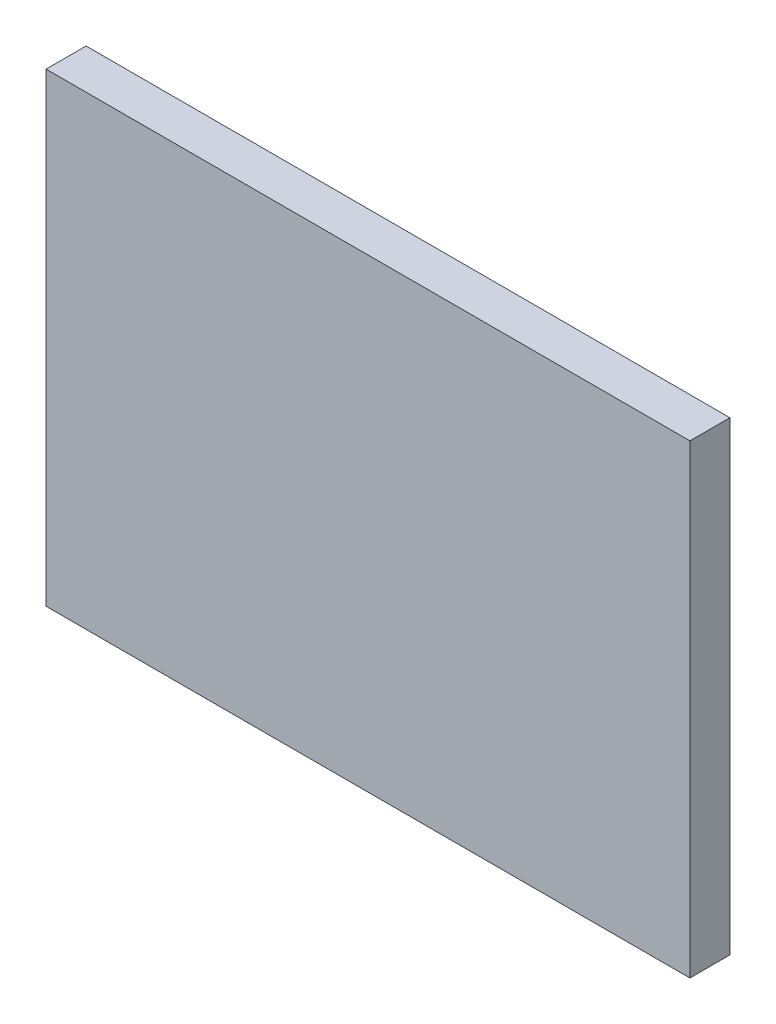
ISO-10303-21;
HEADER;
FILE_DESCRIPTION(('STEP AP214'),'2;1');
FILE_NAME('part.step','',(''),(''),'','','');
FILE_SCHEMA(('AUTOMOTIVE_DESIGN { 1 0 10303 214 1 1 1 1 }'));
ENDSEC;
DATA;
#1=APPLICATION_CONTEXT('core data for automotive mechanical design processes');
#2=APPLICATION_PROTOCOL_DEFINITION('international standard','automotive_design',2000,#1);
#3=PRODUCT_CONTEXT('',#1,'mechanical');
#4=PRODUCT('Part','Part','',(#3));
#5=PRODUCT_RELATED_PRODUCT_CATEGORY('part','',(#4));
#6=PRODUCT_DEFINITION_FORMATION('','',#4);
#7=PRODUCT_DEFINITION_CONTEXT('part definition',#1,'design');
#8=PRODUCT_DEFINITION('design','',#6,#7);
#9=PRODUCT_DEFINITION_SHAPE('','',#8);
#10=(LENGTH_UNIT() NAMED_UNIT(*) SI_UNIT(.MILLI.,.METRE.));
#11=(NAMED_UNIT(*) PLANE_ANGLE_UNIT() SI_UNIT($,.RADIAN.));
#12=(NAMED_UNIT(*) SI_UNIT($,.STERADIAN.) SOLID_ANGLE_UNIT());
#13=UNCERTAINTY_MEASURE_WITH_UNIT(LENGTH_MEASURE(1.E-05),#10,'distance_accuracy_value','');
#14=(GEOMETRIC_REPRESENTATION_CONTEXT(3) GLOBAL_UNCERTAINTY_ASSIGNED_CONTEXT((#13)) GLOBAL_UNIT_ASSIGNED_CONTEXT((#10,
#11,#12)) REPRESENTATION_CONTEXT('',''));
#15=CARTESIAN_POINT('',(0.,0.,0.));
#16=DIRECTION('',(0.,0.,1.));
#17=DIRECTION('',(1.,0.,0.));
#18=AXIS2_PLACEMENT_3D('',#15,#16,#17);
#19=CARTESIAN_POINT('',(34.59999938,25.0000008,4.29999902));
#20=DIRECTION('',(0.,0.,-1.));
#21=DIRECTION('',(-1.,0.,0.));
#22=AXIS2_PLACEMENT_3D('',#19,#20,#21);
#23=PLANE('',#22);
#24=DIRECTION('',(0.,1.,0.));
#25=VECTOR('',#24,1.);
#26=CARTESIAN_POINT('',(-34.59999938,25.0000008,4.29999902));
#27=LINE('',#26,#25);
#28=CARTESIAN_POINT('',(-34.59999938,25.0000008,4.29999902));
#29=VERTEX_POINT('',#28);
#30=CARTESIAN_POINT('',(-34.59999938,-25.0000008,4.29999902));
#31=VERTEX_POINT('',#30);
#32=EDGE_CURVE('E55',#29,#31,#27,.F.);
#33=ORIENTED_EDGE('',*,*,#32,.T.);
#34=DIRECTION('',(1.,0.,0.));
#35=VECTOR('',#34,1.);
#36=CARTESIAN_POINT('',(-34.59999938,-25.0000008,4.29999902));
#37=LINE('',#36,#35);
#38=CARTESIAN_POINT('',(34.59999938,-25.0000008,4.29999902));
#39=VERTEX_POINT('',#38);
#40=EDGE_CURVE('E57',#31,#39,#37,.T.);
#41=ORIENTED_EDGE('',*,*,#40,.T.);
#42=DIRECTION('',(0.,1.,0.));
#43=VECTOR('',#42,1.);
#44=CARTESIAN_POINT('',(34.59999938,-25.0000008,4.29999902));
#45=LINE('',#44,#43);
#46=CARTESIAN_POINT('',(34.59999938,25.0000008,4.29999902));
#47=VERTEX_POINT('',#46);
#48=EDGE_CURVE('E20',#39,#47,#45,.T.);
#49=ORIENTED_EDGE('',*,*,#48,.T.);
#50=DIRECTION('',(1.,0.,0.));
#51=VECTOR('',#50,1.);
#52=CARTESIAN_POINT('',(34.59999938,25.0000008,4.29999902));
#53=LINE('',#52,#51);
#54=EDGE_CURVE('E80',#47,#29,#53,.F.);
#55=ORIENTED_EDGE('',*,*,#54,.T.);
#56=EDGE_LOOP('',(#33,#41,#49,#55));
#57=FACE_BOUND('',#56,.T.);
#58=ADVANCED_FACE('F17',(#57),#23,.F.);
#59=CARTESIAN_POINT('',(34.59999938,-25.0000008,0.));
#60=DIRECTION('',(-1.,0.,0.));
#61=DIRECTION('',(0.,0.,1.));
#62=AXIS2_PLACEMENT_3D('',#59,#60,#61);
#63=PLANE('',#62);
#64=DIRECTION('',(0.,0.,-1.));
#65=VECTOR('',#64,1.);
#66=CARTESIAN_POINT('',(34.59999938,25.0000008,0.));
#67=LINE('',#66,#65);
#68=CARTESIAN_POINT('',(34.59999938,25.0000008,0.));
#69=VERTEX_POINT('',#68);
#70=EDGE_CURVE('E68',#69,#47,#67,.F.);
#71=ORIENTED_EDGE('',*,*,#70,.T.);
#72=ORIENTED_EDGE('',*,*,#48,.F.);
#73=DIRECTION('',(0.,0.,1.));
#74=VECTOR('',#73,1.);
#75=CARTESIAN_POINT('',(34.59999938,-25.0000008,0.));
#76=LINE('',#75,#74);
#77=CARTESIAN_POINT('',(34.59999938,-25.0000008,0.));
#78=VERTEX_POINT('',#77);
#79=EDGE_CURVE('E63',#39,#78,#76,.F.);
#80=ORIENTED_EDGE('',*,*,#79,.T.);
#81=DIRECTION('',(0.,1.,0.));
#82=VECTOR('',#81,1.);
#83=CARTESIAN_POINT('',(34.59999938,25.0000008,0.));
#84=LINE('',#83,#82);
#85=EDGE_CURVE('E83',#69,#78,#84,.F.);
#86=ORIENTED_EDGE('',*,*,#85,.F.);
#87=EDGE_LOOP('',(#71,#72,#80,#86));
#88=FACE_BOUND('',#87,.T.);
#89=ADVANCED_FACE('F65',(#88),#63,.F.);
#90=CARTESIAN_POINT('',(-34.59999938,-25.0000008,0.));
#91=DIRECTION('',(0.,1.,0.));
#92=DIRECTION('',(0.,0.,1.));
#93=AXIS2_PLACEMENT_3D('',#90,#91,#92);
#94=PLANE('',#93);
#95=ORIENTED_EDGE('',*,*,#79,.F.);
#96=ORIENTED_EDGE('',*,*,#40,.F.);
#97=DIRECTION('',(0.,0.,-1.));
#98=VECTOR('',#97,1.);
#99=CARTESIAN_POINT('',(-34.59999938,-25.0000008,0.));
#100=LINE('',#99,#98);
#101=CARTESIAN_POINT('',(-34.59999938,-25.0000008,0.));
#102=VERTEX_POINT('',#101);
#103=EDGE_CURVE('E75',#31,#102,#100,.T.);
#104=ORIENTED_EDGE('',*,*,#103,.T.);
#105=DIRECTION('',(-1.,0.,0.));
#106=VECTOR('',#105,1.);
#107=CARTESIAN_POINT('',(34.59999938,-25.0000008,0.));
#108=LINE('',#107,#106);
#109=EDGE_CURVE('E72',#78,#102,#108,.T.);
#110=ORIENTED_EDGE('',*,*,#109,.F.);
#111=EDGE_LOOP('',(#95,#96,#104,#110));
#112=FACE_BOUND('',#111,.T.);
#113=ADVANCED_FACE('F70',(#112),#94,.F.);
#114=CARTESIAN_POINT('',(-34.59999938,25.0000008,0.));
#115=DIRECTION('',(1.,0.,0.));
#116=DIRECTION('',(0.,0.,-1.));
#117=AXIS2_PLACEMENT_3D('',#114,#115,#116);
#118=PLANE('',#117);
#119=ORIENTED_EDGE('',*,*,#103,.F.);
#120=ORIENTED_EDGE('',*,*,#32,.F.);
#121=DIRECTION('',(0.,0.,-1.));
#122=VECTOR('',#121,1.);
#123=CARTESIAN_POINT('',(-34.59999938,25.0000008,0.));
#124=LINE('',#123,#122);
#125=CARTESIAN_POINT('',(-34.59999938,25.0000008,0.));
#126=VERTEX_POINT('',#125);
#127=EDGE_CURVE('E35',#29,#126,#124,.T.);
#128=ORIENTED_EDGE('',*,*,#127,.T.);
#129=DIRECTION('',(0.,1.,0.));
#130=VECTOR('',#129,1.);
#131=CARTESIAN_POINT('',(-34.59999938,25.0000008,0.));
#132=LINE('',#131,#130);
#133=EDGE_CURVE('E26',#102,#126,#132,.T.);
#134=ORIENTED_EDGE('',*,*,#133,.F.);
#135=EDGE_LOOP('',(#119,#120,#128,#134));
#136=FACE_BOUND('',#135,.T.);
#137=ADVANCED_FACE('F89',(#136),#118,.F.);
#138=CARTESIAN_POINT('',(34.59999938,25.0000008,0.));
#139=DIRECTION('',(0.,-1.,0.));
#140=DIRECTION('',(0.,0.,-1.));
#141=AXIS2_PLACEMENT_3D('',#138,#139,#140);
#142=PLANE('',#141);
#143=ORIENTED_EDGE('',*,*,#127,.F.);
#144=ORIENTED_EDGE('',*,*,#54,.F.);
#145=ORIENTED_EDGE('',*,*,#70,.F.);
#146=DIRECTION('',(-1.,0.,0.));
#147=VECTOR('',#146,1.);
#148=CARTESIAN_POINT('',(34.59999938,25.0000008,0.));
#149=LINE('',#148,#147);
#150=EDGE_CURVE('E11',#126,#69,#149,.F.);
#151=ORIENTED_EDGE('',*,*,#150,.F.);
#152=EDGE_LOOP('',(#143,#144,#145,#151));
#153=FACE_BOUND('',#152,.T.);
#154=ADVANCED_FACE('F91',(#153),#142,.F.);
#155=CARTESIAN_POINT('',(34.59999938,25.0000008,0.));
#156=DIRECTION('',(0.,0.,-1.));
#157=DIRECTION('',(-1.,0.,0.));
#158=AXIS2_PLACEMENT_3D('',#155,#156,#157);
#159=PLANE('',#158);
#160=ORIENTED_EDGE('',*,*,#133,.T.);
#161=ORIENTED_EDGE('',*,*,#150,.T.);
#162=ORIENTED_EDGE('',*,*,#85,.T.);
#163=ORIENTED_EDGE('',*,*,#109,.T.);
#164=EDGE_LOOP('',(#160,#161,#162,#163));
#165=FACE_BOUND('',#164,.T.);
#166=ADVANCED_FACE('F88',(#165),#159,.T.);
#167=CLOSED_SHELL('',(#58,#89,#113,#137,#154,#166));
#168=MANIFOLD_SOLID_BREP('B1',#167);
#169=ADVANCED_BREP_SHAPE_REPRESENTATION('',(#18,#168),#14);
#170=SHAPE_DEFINITION_REPRESENTATION(#9,#169);
ENDSEC;
END-ISO-10303-21;
